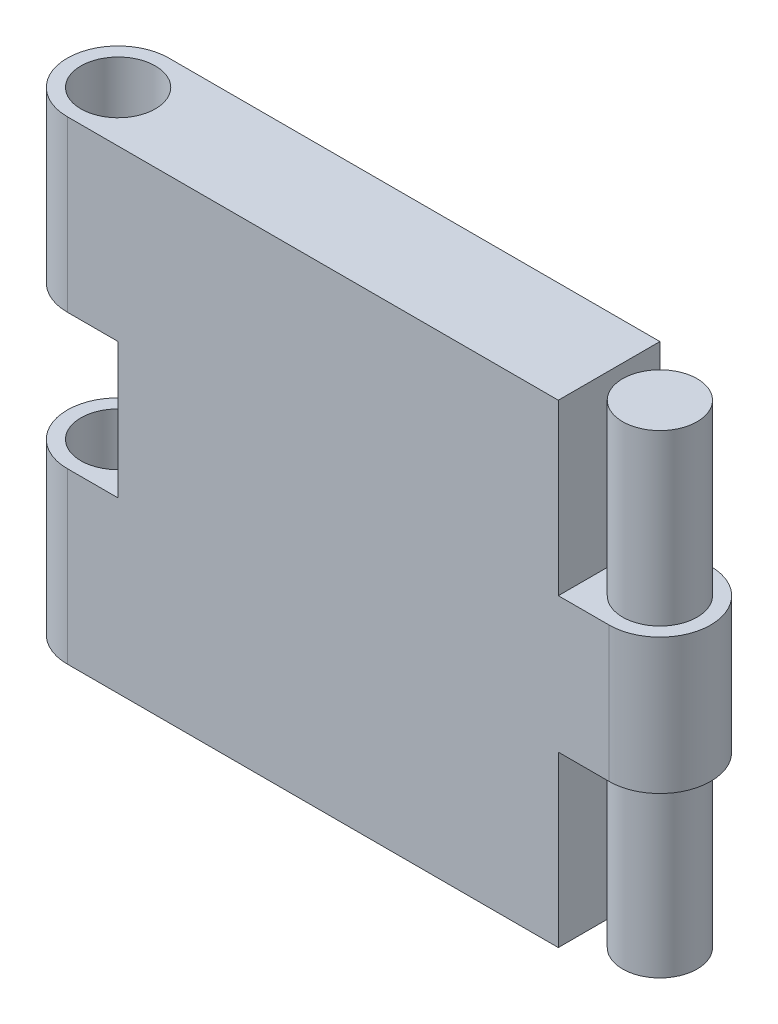
ISO-10303-21;
HEADER;
FILE_DESCRIPTION(('STEP AP214'),'2;1');
FILE_NAME('part.step','',(''),(''),'','','');
FILE_SCHEMA(('AUTOMOTIVE_DESIGN { 1 0 10303 214 1 1 1 1 }'));
ENDSEC;
DATA;
#1=APPLICATION_CONTEXT('core data for automotive mechanical design processes');
#2=APPLICATION_PROTOCOL_DEFINITION('international standard','automotive_design',2000,#1);
#3=PRODUCT_CONTEXT('',#1,'mechanical');
#4=PRODUCT('Part','Part','',(#3));
#5=PRODUCT_RELATED_PRODUCT_CATEGORY('part','',(#4));
#6=PRODUCT_DEFINITION_FORMATION('','',#4);
#7=PRODUCT_DEFINITION_CONTEXT('part definition',#1,'design');
#8=PRODUCT_DEFINITION('design','',#6,#7);
#9=PRODUCT_DEFINITION_SHAPE('','',#8);
#10=(LENGTH_UNIT() NAMED_UNIT(*) SI_UNIT(.MILLI.,.METRE.));
#11=(NAMED_UNIT(*) PLANE_ANGLE_UNIT() SI_UNIT($,.RADIAN.));
#12=(NAMED_UNIT(*) SI_UNIT($,.STERADIAN.) SOLID_ANGLE_UNIT());
#13=UNCERTAINTY_MEASURE_WITH_UNIT(LENGTH_MEASURE(1.E-05),#10,'distance_accuracy_value','');
#14=(GEOMETRIC_REPRESENTATION_CONTEXT(3) GLOBAL_UNCERTAINTY_ASSIGNED_CONTEXT((#13)) GLOBAL_UNIT_ASSIGNED_CONTEXT((#10,
#11,#12)) REPRESENTATION_CONTEXT('',''));
#15=CARTESIAN_POINT('',(0.,0.,0.));
#16=DIRECTION('',(0.,0.,1.));
#17=DIRECTION('',(1.,0.,0.));
#18=AXIS2_PLACEMENT_3D('',#15,#16,#17);
#19=CARTESIAN_POINT('',(47.5,10.,-7.5));
#20=DIRECTION('',(0.,1.,0.));
#21=DIRECTION('',(0.,0.,1.));
#22=AXIS2_PLACEMENT_3D('',#19,#20,#21);
#23=CYLINDRICAL_SURFACE('',#22,7.5);
#24=DIRECTION('',(0.,-1.,0.));
#25=VECTOR('',#24,1.);
#26=CARTESIAN_POINT('',(47.5,10.,-15.));
#27=LINE('',#26,#25);
#28=CARTESIAN_POINT('',(47.5,10.,-15.));
#29=VERTEX_POINT('',#28);
#30=CARTESIAN_POINT('',(47.5,-10.,-15.));
#31=VERTEX_POINT('',#30);
#32=EDGE_CURVE('E193',#29,#31,#27,.T.);
#33=ORIENTED_EDGE('',*,*,#32,.F.);
#34=CARTESIAN_POINT('',(47.5,10.,-7.5));
#35=DIRECTION('',(0.,1.,0.));
#36=DIRECTION('',(0.,0.,1.));
#37=AXIS2_PLACEMENT_3D('',#34,#35,#36);
#38=CIRCLE('',#37,7.5);
#39=CARTESIAN_POINT('',(47.5,10.,0.));
#40=VERTEX_POINT('',#39);
#41=EDGE_CURVE('E44',#40,#29,#38,.T.);
#42=ORIENTED_EDGE('',*,*,#41,.F.);
#43=DIRECTION('',(0.,1.,0.));
#44=VECTOR('',#43,1.);
#45=CARTESIAN_POINT('',(47.5,0.,0.));
#46=LINE('',#45,#44);
#47=CARTESIAN_POINT('',(47.5,-10.,0.));
#48=VERTEX_POINT('',#47);
#49=EDGE_CURVE('E195',#48,#40,#46,.T.);
#50=ORIENTED_EDGE('',*,*,#49,.F.);
#51=CARTESIAN_POINT('',(47.5,-10.,-7.5));
#52=DIRECTION('',(0.,1.,0.));
#53=DIRECTION('',(0.,0.,1.));
#54=AXIS2_PLACEMENT_3D('',#51,#52,#53);
#55=CIRCLE('',#54,7.5);
#56=EDGE_CURVE('E11',#31,#48,#55,.F.);
#57=ORIENTED_EDGE('',*,*,#56,.F.);
#58=EDGE_LOOP('',(#33,#42,#50,#57));
#59=FACE_BOUND('',#58,.T.);
#60=ADVANCED_FACE('F36',(#59),#23,.T.);
#61=CARTESIAN_POINT('',(40.,35.,-15.));
#62=DIRECTION('',(1.,0.,0.));
#63=DIRECTION('',(0.,0.,-1.));
#64=AXIS2_PLACEMENT_3D('',#61,#62,#63);
#65=PLANE('',#64);
#66=DIRECTION('',(0.,1.,0.));
#67=VECTOR('',#66,1.);
#68=CARTESIAN_POINT('',(40.,35.,-15.));
#69=LINE('',#68,#67);
#70=CARTESIAN_POINT('',(40.,-35.,-15.));
#71=VERTEX_POINT('',#70);
#72=CARTESIAN_POINT('',(40.,-10.,-15.));
#73=VERTEX_POINT('',#72);
#74=EDGE_CURVE('E145',#71,#73,#69,.T.);
#75=ORIENTED_EDGE('',*,*,#74,.T.);
#76=DIRECTION('',(0.,0.,1.));
#77=VECTOR('',#76,1.);
#78=CARTESIAN_POINT('',(40.,-10.,-15.));
#79=LINE('',#78,#77);
#80=CARTESIAN_POINT('',(40.,-10.,0.));
#81=VERTEX_POINT('',#80);
#82=EDGE_CURVE('E202',#73,#81,#79,.T.);
#83=ORIENTED_EDGE('',*,*,#82,.T.);
#84=DIRECTION('',(0.,1.,0.));
#85=VECTOR('',#84,1.);
#86=CARTESIAN_POINT('',(40.,35.,0.));
#87=LINE('',#86,#85);
#88=CARTESIAN_POINT('',(40.,-35.,0.));
#89=VERTEX_POINT('',#88);
#90=EDGE_CURVE('E159',#89,#81,#87,.T.);
#91=ORIENTED_EDGE('',*,*,#90,.F.);
#92=DIRECTION('',(0.,0.,1.));
#93=VECTOR('',#92,1.);
#94=CARTESIAN_POINT('',(40.,-35.,-15.));
#95=LINE('',#94,#93);
#96=EDGE_CURVE('E164',#71,#89,#95,.T.);
#97=ORIENTED_EDGE('',*,*,#96,.F.);
#98=EDGE_LOOP('',(#75,#83,#91,#97));
#99=FACE_BOUND('',#98,.T.);
#100=ADVANCED_FACE('F270',(#99),#65,.T.);
#101=CARTESIAN_POINT('',(-32.5,35.,-7.5));
#102=DIRECTION('',(0.,-1.,0.));
#103=DIRECTION('',(1.,0.,0.));
#104=AXIS2_PLACEMENT_3D('',#101,#102,#103);
#105=CYLINDRICAL_SURFACE('',#104,7.5);
#106=DIRECTION('',(0.,-1.,0.));
#107=VECTOR('',#106,1.);
#108=CARTESIAN_POINT('',(-32.5,0.,0.));
#109=LINE('',#108,#107);
#110=CARTESIAN_POINT('',(-32.5,-10.,0.));
#111=VERTEX_POINT('',#110);
#112=CARTESIAN_POINT('',(-32.5,-35.,0.));
#113=VERTEX_POINT('',#112);
#114=EDGE_CURVE('E167',#111,#113,#109,.T.);
#115=ORIENTED_EDGE('',*,*,#114,.F.);
#116=CARTESIAN_POINT('',(-32.5,-10.,-7.5));
#117=DIRECTION('',(0.,1.,0.));
#118=DIRECTION('',(0.,0.,1.));
#119=AXIS2_PLACEMENT_3D('',#116,#117,#118);
#120=CIRCLE('',#119,7.5);
#121=CARTESIAN_POINT('',(-32.5,-10.,-15.));
#122=VERTEX_POINT('',#121);
#123=EDGE_CURVE('E184',#111,#122,#120,.F.);
#124=ORIENTED_EDGE('',*,*,#123,.T.);
#125=DIRECTION('',(0.,1.,0.));
#126=VECTOR('',#125,1.);
#127=CARTESIAN_POINT('',(-32.5,35.,-15.));
#128=LINE('',#127,#126);
#129=CARTESIAN_POINT('',(-32.5,-35.,-15.));
#130=VERTEX_POINT('',#129);
#131=EDGE_CURVE('E173',#130,#122,#128,.T.);
#132=ORIENTED_EDGE('',*,*,#131,.F.);
#133=CARTESIAN_POINT('',(-32.5,-35.,-7.5));
#134=DIRECTION('',(0.,-1.,0.));
#135=DIRECTION('',(0.,0.,-1.));
#136=AXIS2_PLACEMENT_3D('',#133,#134,#135);
#137=CIRCLE('',#136,7.5);
#138=EDGE_CURVE('E178',#113,#130,#137,.T.);
#139=ORIENTED_EDGE('',*,*,#138,.F.);
#140=EDGE_LOOP('',(#115,#124,#132,#139));
#141=FACE_BOUND('',#140,.T.);
#142=ADVANCED_FACE('F263',(#141),#105,.T.);
#143=CARTESIAN_POINT('',(-32.5,50.556349186104,-7.5));
#144=DIRECTION('',(0.,-1.,0.));
#145=DIRECTION('',(0.,0.,-1.));
#146=AXIS2_PLACEMENT_3D('',#143,#144,#145);
#147=CYLINDRICAL_SURFACE('',#146,5.5);
#148=CARTESIAN_POINT('',(-32.5,-35.,-7.5));
#149=DIRECTION('',(0.,-1.,0.));
#150=DIRECTION('',(0.,0.,-1.));
#151=AXIS2_PLACEMENT_3D('',#148,#149,#150);
#152=CIRCLE('',#151,5.5);
#153=CARTESIAN_POINT('',(-32.5,-35.,-13.));
#154=VERTEX_POINT('',#153);
#155=EDGE_CURVE('E230',#154,#154,#152,.F.);
#156=ORIENTED_EDGE('',*,*,#155,.F.);
#157=EDGE_LOOP('',(#156));
#158=FACE_BOUND('',#157,.T.);
#159=CARTESIAN_POINT('',(-32.5,-10.,-7.5));
#160=DIRECTION('',(0.,1.,0.));
#161=DIRECTION('',(0.,0.,1.));
#162=AXIS2_PLACEMENT_3D('',#159,#160,#161);
#163=CIRCLE('',#162,5.5);
#164=CARTESIAN_POINT('',(-32.5,-10.,-2.));
#165=VERTEX_POINT('',#164);
#166=EDGE_CURVE('E181',#165,#165,#163,.T.);
#167=ORIENTED_EDGE('',*,*,#166,.T.);
#168=EDGE_LOOP('',(#167));
#169=FACE_BOUND('',#168,.T.);
#170=ADVANCED_FACE('F282',(#158,#169),#147,.F.);
#171=CARTESIAN_POINT('',(-32.5,10.,-7.5));
#172=DIRECTION('',(0.,1.,0.));
#173=DIRECTION('',(0.,0.,1.));
#174=AXIS2_PLACEMENT_3D('',#171,#172,#173);
#175=CIRCLE('',#174,7.5);
#176=CARTESIAN_POINT('',(-32.5,10.,0.));
#177=VERTEX_POINT('',#176);
#178=CARTESIAN_POINT('',(-32.5,10.,-15.));
#179=VERTEX_POINT('',#178);
#180=EDGE_CURVE('E189',#177,#179,#175,.F.);
#181=ORIENTED_EDGE('',*,*,#180,.F.);
#182=CARTESIAN_POINT('',(-32.5,35.,0.));
#183=VERTEX_POINT('',#182);
#184=EDGE_CURVE('E169',#183,#177,#109,.T.);
#185=ORIENTED_EDGE('',*,*,#184,.F.);
#186=CARTESIAN_POINT('',(-32.5,35.,-7.5));
#187=DIRECTION('',(0.,1.,0.));
#188=DIRECTION('',(0.,0.,1.));
#189=AXIS2_PLACEMENT_3D('',#186,#187,#188);
#190=CIRCLE('',#189,7.5);
#191=CARTESIAN_POINT('',(-32.5,35.,-15.));
#192=VERTEX_POINT('',#191);
#193=EDGE_CURVE('E176',#192,#183,#190,.T.);
#194=ORIENTED_EDGE('',*,*,#193,.F.);
#195=EDGE_CURVE('E172',#179,#192,#128,.T.);
#196=ORIENTED_EDGE('',*,*,#195,.F.);
#197=EDGE_LOOP('',(#181,#185,#194,#196));
#198=FACE_BOUND('',#197,.T.);
#199=ADVANCED_FACE('F245',(#198),#105,.T.);
#200=DIRECTION('',(0.,0.,1.));
#201=VECTOR('',#200,1.);
#202=CARTESIAN_POINT('',(40.,10.,-15.));
#203=LINE('',#202,#201);
#204=CARTESIAN_POINT('',(40.,10.,-15.));
#205=VERTEX_POINT('',#204);
#206=CARTESIAN_POINT('',(40.,10.,0.));
#207=VERTEX_POINT('',#206);
#208=EDGE_CURVE('E125',#205,#207,#203,.T.);
#209=ORIENTED_EDGE('',*,*,#208,.F.);
#210=CARTESIAN_POINT('',(40.,35.,-15.));
#211=VERTEX_POINT('',#210);
#212=EDGE_CURVE('E136',#205,#211,#69,.T.);
#213=ORIENTED_EDGE('',*,*,#212,.T.);
#214=DIRECTION('',(0.,0.,1.));
#215=VECTOR('',#214,1.);
#216=CARTESIAN_POINT('',(40.,35.,-15.));
#217=LINE('',#216,#215);
#218=CARTESIAN_POINT('',(40.,35.,0.));
#219=VERTEX_POINT('',#218);
#220=EDGE_CURVE('E158',#211,#219,#217,.T.);
#221=ORIENTED_EDGE('',*,*,#220,.T.);
#222=EDGE_CURVE('E138',#207,#219,#87,.T.);
#223=ORIENTED_EDGE('',*,*,#222,.F.);
#224=EDGE_LOOP('',(#209,#213,#221,#223));
#225=FACE_BOUND('',#224,.T.);
#226=ADVANCED_FACE('F134',(#225),#65,.T.);
#227=CARTESIAN_POINT('',(-40.,-35.,-15.));
#228=DIRECTION('',(0.,-1.,0.));
#229=DIRECTION('',(0.,0.,-1.));
#230=AXIS2_PLACEMENT_3D('',#227,#228,#229);
#231=PLANE('',#230);
#232=ORIENTED_EDGE('',*,*,#155,.T.);
#233=EDGE_LOOP('',(#232));
#234=FACE_BOUND('',#233,.T.);
#235=DIRECTION('',(1.,0.,0.));
#236=VECTOR('',#235,1.);
#237=CARTESIAN_POINT('',(-40.,-35.,0.));
#238=LINE('',#237,#236);
#239=EDGE_CURVE('E146',#113,#89,#238,.T.);
#240=ORIENTED_EDGE('',*,*,#239,.F.);
#241=ORIENTED_EDGE('',*,*,#138,.T.);
#242=DIRECTION('',(1.,0.,0.));
#243=VECTOR('',#242,1.);
#244=CARTESIAN_POINT('',(-40.,-35.,-15.));
#245=LINE('',#244,#243);
#246=EDGE_CURVE('E156',#130,#71,#245,.T.);
#247=ORIENTED_EDGE('',*,*,#246,.T.);
#248=ORIENTED_EDGE('',*,*,#96,.T.);
#249=EDGE_LOOP('',(#240,#241,#247,#248));
#250=FACE_BOUND('',#249,.T.);
#251=ADVANCED_FACE('F266',(#234,#250),#231,.T.);
#252=CARTESIAN_POINT('',(-40.,35.,-15.));
#253=DIRECTION('',(0.,1.,0.));
#254=DIRECTION('',(0.,0.,1.));
#255=AXIS2_PLACEMENT_3D('',#252,#253,#254);
#256=PLANE('',#255);
#257=CARTESIAN_POINT('',(-32.5,35.,-7.5));
#258=DIRECTION('',(0.,1.,0.));
#259=DIRECTION('',(0.,0.,1.));
#260=AXIS2_PLACEMENT_3D('',#257,#258,#259);
#261=CIRCLE('',#260,5.5);
#262=CARTESIAN_POINT('',(-32.5,35.,-2.));
#263=VERTEX_POINT('',#262);
#264=EDGE_CURVE('E153',#263,#263,#261,.T.);
#265=ORIENTED_EDGE('',*,*,#264,.F.);
#266=EDGE_LOOP('',(#265));
#267=FACE_BOUND('',#266,.T.);
#268=DIRECTION('',(-1.,0.,0.));
#269=VECTOR('',#268,1.);
#270=CARTESIAN_POINT('',(-40.,35.,-15.));
#271=LINE('',#270,#269);
#272=EDGE_CURVE('E144',#211,#192,#271,.T.);
#273=ORIENTED_EDGE('',*,*,#272,.T.);
#274=ORIENTED_EDGE('',*,*,#193,.T.);
#275=DIRECTION('',(-1.,0.,0.));
#276=VECTOR('',#275,1.);
#277=CARTESIAN_POINT('',(-40.,35.,0.));
#278=LINE('',#277,#276);
#279=EDGE_CURVE('E149',#219,#183,#278,.T.);
#280=ORIENTED_EDGE('',*,*,#279,.F.);
#281=ORIENTED_EDGE('',*,*,#220,.F.);
#282=EDGE_LOOP('',(#273,#274,#280,#281));
#283=FACE_BOUND('',#282,.T.);
#284=ADVANCED_FACE('F239',(#267,#283),#256,.T.);
#285=CARTESIAN_POINT('',(0.,0.,-15.));
#286=DIRECTION('',(0.,0.,1.));
#287=DIRECTION('',(1.,0.,0.));
#288=AXIS2_PLACEMENT_3D('',#285,#286,#287);
#289=PLANE('',#288);
#290=DIRECTION('',(-1.,0.,0.));
#291=VECTOR('',#290,1.);
#292=CARTESIAN_POINT('',(40.,10.,-15.));
#293=LINE('',#292,#291);
#294=EDGE_CURVE('E121',#29,#205,#293,.T.);
#295=ORIENTED_EDGE('',*,*,#294,.F.);
#296=ORIENTED_EDGE('',*,*,#32,.T.);
#297=DIRECTION('',(-1.,0.,0.));
#298=VECTOR('',#297,1.);
#299=CARTESIAN_POINT('',(40.,-10.,-15.));
#300=LINE('',#299,#298);
#301=EDGE_CURVE('E200',#31,#73,#300,.T.);
#302=ORIENTED_EDGE('',*,*,#301,.T.);
#303=ORIENTED_EDGE('',*,*,#74,.F.);
#304=ORIENTED_EDGE('',*,*,#246,.F.);
#305=ORIENTED_EDGE('',*,*,#131,.T.);
#306=DIRECTION('',(-1.,0.,0.));
#307=VECTOR('',#306,1.);
#308=CARTESIAN_POINT('',(-40.,-10.,-15.));
#309=LINE('',#308,#307);
#310=CARTESIAN_POINT('',(-25.,-10.,-15.));
#311=VERTEX_POINT('',#310);
#312=EDGE_CURVE('E211',#311,#122,#309,.T.);
#313=ORIENTED_EDGE('',*,*,#312,.F.);
#314=DIRECTION('',(0.,-1.,0.));
#315=VECTOR('',#314,1.);
#316=CARTESIAN_POINT('',(-25.,10.,-15.));
#317=LINE('',#316,#315);
#318=CARTESIAN_POINT('',(-25.,10.,-15.));
#319=VERTEX_POINT('',#318);
#320=EDGE_CURVE('E185',#319,#311,#317,.T.);
#321=ORIENTED_EDGE('',*,*,#320,.F.);
#322=DIRECTION('',(-1.,0.,0.));
#323=VECTOR('',#322,1.);
#324=CARTESIAN_POINT('',(-40.,10.,-15.));
#325=LINE('',#324,#323);
#326=EDGE_CURVE('E219',#319,#179,#325,.T.);
#327=ORIENTED_EDGE('',*,*,#326,.T.);
#328=ORIENTED_EDGE('',*,*,#195,.T.);
#329=ORIENTED_EDGE('',*,*,#272,.F.);
#330=ORIENTED_EDGE('',*,*,#212,.F.);
#331=EDGE_LOOP('',(#295,#296,#302,#303,#304,#305,#313,#321,#327,#328,#329,#330));
#332=FACE_BOUND('',#331,.T.);
#333=ADVANCED_FACE('F142',(#332),#289,.F.);
#334=CARTESIAN_POINT('',(0.,0.,0.));
#335=DIRECTION('',(0.,0.,1.));
#336=DIRECTION('',(1.,0.,0.));
#337=AXIS2_PLACEMENT_3D('',#334,#335,#336);
#338=PLANE('',#337);
#339=DIRECTION('',(1.,0.,0.));
#340=VECTOR('',#339,1.);
#341=CARTESIAN_POINT('',(40.,-10.,0.));
#342=LINE('',#341,#340);
#343=EDGE_CURVE('E199',#81,#48,#342,.T.);
#344=ORIENTED_EDGE('',*,*,#343,.T.);
#345=ORIENTED_EDGE('',*,*,#49,.T.);
#346=DIRECTION('',(1.,0.,0.));
#347=VECTOR('',#346,1.);
#348=CARTESIAN_POINT('',(40.,10.,0.));
#349=LINE('',#348,#347);
#350=EDGE_CURVE('E139',#207,#40,#349,.T.);
#351=ORIENTED_EDGE('',*,*,#350,.F.);
#352=ORIENTED_EDGE('',*,*,#222,.T.);
#353=ORIENTED_EDGE('',*,*,#279,.T.);
#354=ORIENTED_EDGE('',*,*,#184,.T.);
#355=DIRECTION('',(1.,0.,0.));
#356=VECTOR('',#355,1.);
#357=CARTESIAN_POINT('',(-40.,10.,0.));
#358=LINE('',#357,#356);
#359=CARTESIAN_POINT('',(-25.,10.,0.));
#360=VERTEX_POINT('',#359);
#361=EDGE_CURVE('E222',#177,#360,#358,.T.);
#362=ORIENTED_EDGE('',*,*,#361,.T.);
#363=DIRECTION('',(0.,-1.,0.));
#364=VECTOR('',#363,1.);
#365=CARTESIAN_POINT('',(-25.,10.,0.));
#366=LINE('',#365,#364);
#367=CARTESIAN_POINT('',(-25.,-10.,0.));
#368=VERTEX_POINT('',#367);
#369=EDGE_CURVE('E225',#360,#368,#366,.T.);
#370=ORIENTED_EDGE('',*,*,#369,.T.);
#371=DIRECTION('',(1.,0.,0.));
#372=VECTOR('',#371,1.);
#373=CARTESIAN_POINT('',(-40.,-10.,0.));
#374=LINE('',#373,#372);
#375=EDGE_CURVE('E214',#111,#368,#374,.T.);
#376=ORIENTED_EDGE('',*,*,#375,.F.);
#377=ORIENTED_EDGE('',*,*,#114,.T.);
#378=ORIENTED_EDGE('',*,*,#239,.T.);
#379=ORIENTED_EDGE('',*,*,#90,.T.);
#380=EDGE_LOOP('',(#344,#345,#351,#352,#353,#354,#362,#370,#376,#377,#378,#379));
#381=FACE_BOUND('',#380,.T.);
#382=ADVANCED_FACE('F198',(#381),#338,.T.);
#383=CARTESIAN_POINT('',(-32.5,10.,-7.5));
#384=DIRECTION('',(0.,1.,0.));
#385=DIRECTION('',(0.,0.,1.));
#386=AXIS2_PLACEMENT_3D('',#383,#384,#385);
#387=CIRCLE('',#386,5.5);
#388=CARTESIAN_POINT('',(-32.5,10.,-2.));
#389=VERTEX_POINT('',#388);
#390=EDGE_CURVE('E186',#389,#389,#387,.T.);
#391=ORIENTED_EDGE('',*,*,#390,.F.);
#392=EDGE_LOOP('',(#391));
#393=FACE_BOUND('',#392,.T.);
#394=ORIENTED_EDGE('',*,*,#264,.T.);
#395=EDGE_LOOP('',(#394));
#396=FACE_BOUND('',#395,.T.);
#397=ADVANCED_FACE('F295',(#393,#396),#147,.F.);
#398=CARTESIAN_POINT('',(-25.,10.,-15.));
#399=DIRECTION('',(-1.,0.,0.));
#400=DIRECTION('',(0.,0.,1.));
#401=AXIS2_PLACEMENT_3D('',#398,#399,#400);
#402=PLANE('',#401);
#403=ORIENTED_EDGE('',*,*,#369,.F.);
#404=DIRECTION('',(0.,0.,-1.));
#405=VECTOR('',#404,1.);
#406=CARTESIAN_POINT('',(-25.,10.,-15.));
#407=LINE('',#406,#405);
#408=EDGE_CURVE('E216',#360,#319,#407,.T.);
#409=ORIENTED_EDGE('',*,*,#408,.T.);
#410=ORIENTED_EDGE('',*,*,#320,.T.);
#411=DIRECTION('',(0.,0.,-1.));
#412=VECTOR('',#411,1.);
#413=CARTESIAN_POINT('',(-25.,-10.,-15.));
#414=LINE('',#413,#412);
#415=EDGE_CURVE('E208',#368,#311,#414,.T.);
#416=ORIENTED_EDGE('',*,*,#415,.F.);
#417=EDGE_LOOP('',(#403,#409,#410,#416));
#418=FACE_BOUND('',#417,.T.);
#419=ADVANCED_FACE('F253',(#418),#402,.T.);
#420=CARTESIAN_POINT('',(0.,10.,0.));
#421=DIRECTION('',(0.,1.,0.));
#422=DIRECTION('',(0.,0.,1.));
#423=AXIS2_PLACEMENT_3D('',#420,#421,#422);
#424=PLANE('',#423);
#425=ORIENTED_EDGE('',*,*,#180,.T.);
#426=ORIENTED_EDGE('',*,*,#326,.F.);
#427=ORIENTED_EDGE('',*,*,#408,.F.);
#428=ORIENTED_EDGE('',*,*,#361,.F.);
#429=EDGE_LOOP('',(#425,#426,#427,#428));
#430=FACE_BOUND('',#429,.T.);
#431=ORIENTED_EDGE('',*,*,#390,.T.);
#432=EDGE_LOOP('',(#431));
#433=FACE_BOUND('',#432,.T.);
#434=ADVANCED_FACE('F249',(#430,#433),#424,.F.);
#435=CARTESIAN_POINT('',(0.,-10.,0.));
#436=DIRECTION('',(0.,1.,0.));
#437=DIRECTION('',(0.,0.,1.));
#438=AXIS2_PLACEMENT_3D('',#435,#436,#437);
#439=PLANE('',#438);
#440=ORIENTED_EDGE('',*,*,#166,.F.);
#441=EDGE_LOOP('',(#440));
#442=FACE_BOUND('',#441,.T.);
#443=ORIENTED_EDGE('',*,*,#375,.T.);
#444=ORIENTED_EDGE('',*,*,#415,.T.);
#445=ORIENTED_EDGE('',*,*,#312,.T.);
#446=ORIENTED_EDGE('',*,*,#123,.F.);
#447=EDGE_LOOP('',(#443,#444,#445,#446));
#448=FACE_BOUND('',#447,.T.);
#449=ADVANCED_FACE('F259',(#442,#448),#439,.T.);
#450=CARTESIAN_POINT('',(0.,-10.,0.));
#451=DIRECTION('',(0.,1.,0.));
#452=DIRECTION('',(0.,0.,1.));
#453=AXIS2_PLACEMENT_3D('',#450,#451,#452);
#454=PLANE('',#453);
#455=CARTESIAN_POINT('',(47.5,-10.,-7.5));
#456=DIRECTION('',(0.,1.,0.));
#457=DIRECTION('',(0.,0.,1.));
#458=AXIS2_PLACEMENT_3D('',#455,#456,#457);
#459=CIRCLE('',#458,5.5);
#460=CARTESIAN_POINT('',(47.5,-10.,-13.));
#461=VERTEX_POINT('',#460);
#462=EDGE_CURVE('E180',#461,#461,#459,.F.);
#463=ORIENTED_EDGE('',*,*,#462,.F.);
#464=EDGE_LOOP('',(#463));
#465=FACE_BOUND('',#464,.T.);
#466=ORIENTED_EDGE('',*,*,#301,.F.);
#467=ORIENTED_EDGE('',*,*,#56,.T.);
#468=ORIENTED_EDGE('',*,*,#343,.F.);
#469=ORIENTED_EDGE('',*,*,#82,.F.);
#470=EDGE_LOOP('',(#466,#467,#468,#469));
#471=FACE_BOUND('',#470,.T.);
#472=ADVANCED_FACE('F273',(#465,#471),#454,.F.);
#473=CARTESIAN_POINT('',(0.,10.,0.));
#474=DIRECTION('',(0.,1.,0.));
#475=DIRECTION('',(0.,0.,1.));
#476=AXIS2_PLACEMENT_3D('',#473,#474,#475);
#477=PLANE('',#476);
#478=CARTESIAN_POINT('',(47.5,10.,-7.5));
#479=DIRECTION('',(0.,1.,0.));
#480=DIRECTION('',(0.,0.,1.));
#481=AXIS2_PLACEMENT_3D('',#478,#479,#480);
#482=CIRCLE('',#481,5.5);
#483=CARTESIAN_POINT('',(47.5,10.,-13.));
#484=VERTEX_POINT('',#483);
#485=EDGE_CURVE('E130',#484,#484,#482,.F.);
#486=ORIENTED_EDGE('',*,*,#485,.T.);
#487=EDGE_LOOP('',(#486));
#488=FACE_BOUND('',#487,.T.);
#489=ORIENTED_EDGE('',*,*,#350,.T.);
#490=ORIENTED_EDGE('',*,*,#41,.T.);
#491=ORIENTED_EDGE('',*,*,#294,.T.);
#492=ORIENTED_EDGE('',*,*,#208,.T.);
#493=EDGE_LOOP('',(#489,#490,#491,#492));
#494=FACE_BOUND('',#493,.T.);
#495=ADVANCED_FACE('F124',(#488,#494),#477,.T.);
#496=CARTESIAN_POINT('',(-40.,35.,-15.));
#497=DIRECTION('',(0.,1.,0.));
#498=DIRECTION('',(0.,0.,1.));
#499=AXIS2_PLACEMENT_3D('',#496,#497,#498);
#500=PLANE('',#499);
#501=CARTESIAN_POINT('',(47.5,35.,-7.5));
#502=DIRECTION('',(0.,1.,0.));
#503=DIRECTION('',(0.,0.,1.));
#504=AXIS2_PLACEMENT_3D('',#501,#502,#503);
#505=CIRCLE('',#504,5.5);
#506=CARTESIAN_POINT('',(47.5,35.,-13.));
#507=VERTEX_POINT('',#506);
#508=EDGE_CURVE('E192',#507,#507,#505,.T.);
#509=ORIENTED_EDGE('',*,*,#508,.T.);
#510=EDGE_LOOP('',(#509));
#511=FACE_BOUND('',#510,.T.);
#512=ADVANCED_FACE('F327',(#511),#500,.T.);
#513=CARTESIAN_POINT('',(47.5,50.556349186104,-7.5));
#514=DIRECTION('',(0.,-1.,0.));
#515=DIRECTION('',(0.,0.,-1.));
#516=AXIS2_PLACEMENT_3D('',#513,#514,#515);
#517=CYLINDRICAL_SURFACE('',#516,5.5);
#518=CARTESIAN_POINT('',(47.5,10.,-13.));
#519=CARTESIAN_POINT('',(47.5,10.2604166666667,-13.));
#520=CARTESIAN_POINT('',(47.5,10.5208333333333,-13.));
#521=CARTESIAN_POINT('',(47.5,11.0416666666667,-13.));
#522=CARTESIAN_POINT('',(47.5,11.3020833333333,-13.));
#523=CARTESIAN_POINT('',(47.5,11.8229166666667,-13.));
#524=CARTESIAN_POINT('',(47.5,12.0833333333333,-13.));
#525=CARTESIAN_POINT('',(47.5,12.6041666666667,-13.));
#526=CARTESIAN_POINT('',(47.5,12.8645833333333,-13.));
#527=CARTESIAN_POINT('',(47.5,13.3854166666667,-13.));
#528=CARTESIAN_POINT('',(47.5,13.6458333333333,-13.));
#529=CARTESIAN_POINT('',(47.5,14.1666666666667,-13.));
#530=CARTESIAN_POINT('',(47.5,14.4270833333333,-13.));
#531=CARTESIAN_POINT('',(47.5,14.9479166666667,-13.));
#532=CARTESIAN_POINT('',(47.5,15.2083333333333,-13.));
#533=CARTESIAN_POINT('',(47.5,15.7291666666667,-13.));
#534=CARTESIAN_POINT('',(47.5,15.9895833333333,-13.));
#535=CARTESIAN_POINT('',(47.5,16.5104166666667,-13.));
#536=CARTESIAN_POINT('',(47.5,16.7708333333333,-13.));
#537=CARTESIAN_POINT('',(47.5,17.2916666666667,-13.));
#538=CARTESIAN_POINT('',(47.5,17.5520833333333,-13.));
#539=CARTESIAN_POINT('',(47.5,18.0729166666667,-13.));
#540=CARTESIAN_POINT('',(47.5,18.3333333333333,-13.));
#541=CARTESIAN_POINT('',(47.5,18.8541666666667,-13.));
#542=CARTESIAN_POINT('',(47.5,19.1145833333333,-13.));
#543=CARTESIAN_POINT('',(47.5,19.6354166666667,-13.));
#544=CARTESIAN_POINT('',(47.5,19.8958333333333,-13.));
#545=CARTESIAN_POINT('',(47.5,20.4166666666667,-13.));
#546=CARTESIAN_POINT('',(47.5,20.6770833333333,-13.));
#547=CARTESIAN_POINT('',(47.5,21.1979166666667,-13.));
#548=CARTESIAN_POINT('',(47.5,21.4583333333333,-13.));
#549=CARTESIAN_POINT('',(47.5,21.9791666666667,-13.));
#550=CARTESIAN_POINT('',(47.5,22.2395833333333,-13.));
#551=CARTESIAN_POINT('',(47.5,22.7604166666667,-13.));
#552=CARTESIAN_POINT('',(47.5,23.0208333333333,-13.));
#553=CARTESIAN_POINT('',(47.5,23.5416666666667,-13.));
#554=CARTESIAN_POINT('',(47.5,23.8020833333333,-13.));
#555=CARTESIAN_POINT('',(47.5,24.3229166666667,-13.));
#556=CARTESIAN_POINT('',(47.5,24.5833333333333,-13.));
#557=CARTESIAN_POINT('',(47.5,25.1041666666667,-13.));
#558=CARTESIAN_POINT('',(47.5,25.3645833333333,-13.));
#559=CARTESIAN_POINT('',(47.5,25.8854166666667,-13.));
#560=CARTESIAN_POINT('',(47.5,26.1458333333333,-13.));
#561=CARTESIAN_POINT('',(47.5,26.6666666666667,-13.));
#562=CARTESIAN_POINT('',(47.5,26.9270833333333,-13.));
#563=CARTESIAN_POINT('',(47.5,27.4479166666667,-13.));
#564=CARTESIAN_POINT('',(47.5,27.7083333333333,-13.));
#565=CARTESIAN_POINT('',(47.5,28.2291666666667,-13.));
#566=CARTESIAN_POINT('',(47.5,28.4895833333333,-13.));
#567=CARTESIAN_POINT('',(47.5,29.0104166666667,-13.));
#568=CARTESIAN_POINT('',(47.5,29.2708333333333,-13.));
#569=CARTESIAN_POINT('',(47.5,29.7916666666667,-13.));
#570=CARTESIAN_POINT('',(47.5,30.0520833333333,-13.));
#571=CARTESIAN_POINT('',(47.5,30.5729166666667,-13.));
#572=CARTESIAN_POINT('',(47.5,30.8333333333333,-13.));
#573=CARTESIAN_POINT('',(47.5,31.3541666666667,-13.));
#574=CARTESIAN_POINT('',(47.5,31.6145833333333,-13.));
#575=CARTESIAN_POINT('',(47.5,32.1354166666667,-13.));
#576=CARTESIAN_POINT('',(47.5,32.3958333333333,-13.));
#577=CARTESIAN_POINT('',(47.5,32.9166666666667,-13.));
#578=CARTESIAN_POINT('',(47.5,33.1770833333333,-13.));
#579=CARTESIAN_POINT('',(47.5,33.6979166666667,-13.));
#580=CARTESIAN_POINT('',(47.5,33.9583333333333,-13.));
#581=CARTESIAN_POINT('',(47.5,34.4791666666667,-13.));
#582=CARTESIAN_POINT('',(47.5,34.7395833333333,-13.));
#583=CARTESIAN_POINT('',(47.5,35.,-13.));
#584=B_SPLINE_CURVE_WITH_KNOTS('',3,(#518,#519,#520,#521,#522,#523,#524,#525,#526,#527,#528,
#529,#530,#531,#532,#533,#534,#535,#536,#537,#538,#539,#540,#541,#542,#543,#544,#545,#546,#547,
#548,#549,#550,#551,#552,#553,#554,#555,#556,#557,#558,#559,#560,#561,#562,#563,#564,#565,#566,
#567,#568,#569,#570,#571,#572,#573,#574,#575,#576,#577,#578,#579,#580,#581,#582,#583),
.UNSPECIFIED.,.F.,.F.,(4,2,2,2,2,2,2,2,2,2,2,2,2,2,2,2,2,2,2,2,2,2,2,2,2,2,2,2,2,2,2,2,4),(0.,
0.781249999999997,1.5625,2.34375,3.125,3.90625,4.6875,5.46875,6.25,7.03125,7.8125,8.59375,9.375,
10.15625,10.9375,11.71875,12.5,13.28125,14.0625,14.84375,15.625,16.40625,17.1875,17.96875,18.75,
19.53125,20.3125,21.09375,21.875,22.65625,23.4375,24.21875,25.),.UNSPECIFIED.);
#585=EDGE_CURVE('BSEAM331',#484,#507,#584,.T.);
#586=ORIENTED_EDGE('',*,*,#485,.F.);
#587=ORIENTED_EDGE('',*,*,#508,.F.);
#588=ORIENTED_EDGE('',*,*,#585,.T.);
#589=ORIENTED_EDGE('',*,*,#585,.F.);
#590=EDGE_LOOP('',(#586,#588,#587,#589));
#591=FACE_BOUND('',#590,.T.);
#592=ADVANCED_FACE('F331',(#591),#517,.T.);
#593=CARTESIAN_POINT('',(47.5,-35.,-7.5));
#594=DIRECTION('',(0.,-1.,0.));
#595=DIRECTION('',(0.,0.,-1.));
#596=AXIS2_PLACEMENT_3D('',#593,#594,#595);
#597=CIRCLE('',#596,5.5);
#598=CARTESIAN_POINT('',(47.5,-35.,-13.));
#599=VERTEX_POINT('',#598);
#600=EDGE_CURVE('E346',#599,#599,#597,.F.);
#601=CARTESIAN_POINT('',(47.5,-35.,-13.));
#602=CARTESIAN_POINT('',(47.5,-34.7395833333333,-13.));
#603=CARTESIAN_POINT('',(47.5,-34.4791666666667,-13.));
#604=CARTESIAN_POINT('',(47.5,-33.9583333333333,-13.));
#605=CARTESIAN_POINT('',(47.5,-33.6979166666667,-13.));
#606=CARTESIAN_POINT('',(47.5,-33.1770833333333,-13.));
#607=CARTESIAN_POINT('',(47.5,-32.9166666666667,-13.));
#608=CARTESIAN_POINT('',(47.5,-32.3958333333333,-13.));
#609=CARTESIAN_POINT('',(47.5,-32.1354166666667,-13.));
#610=CARTESIAN_POINT('',(47.5,-31.6145833333333,-13.));
#611=CARTESIAN_POINT('',(47.5,-31.3541666666667,-13.));
#612=CARTESIAN_POINT('',(47.5,-30.8333333333333,-13.));
#613=CARTESIAN_POINT('',(47.5,-30.5729166666667,-13.));
#614=CARTESIAN_POINT('',(47.5,-30.0520833333333,-13.));
#615=CARTESIAN_POINT('',(47.5,-29.7916666666667,-13.));
#616=CARTESIAN_POINT('',(47.5,-29.2708333333333,-13.));
#617=CARTESIAN_POINT('',(47.5,-29.0104166666667,-13.));
#618=CARTESIAN_POINT('',(47.5,-28.4895833333333,-13.));
#619=CARTESIAN_POINT('',(47.5,-28.2291666666667,-13.));
#620=CARTESIAN_POINT('',(47.5,-27.7083333333333,-13.));
#621=CARTESIAN_POINT('',(47.5,-27.4479166666667,-13.));
#622=CARTESIAN_POINT('',(47.5,-26.9270833333333,-13.));
#623=CARTESIAN_POINT('',(47.5,-26.6666666666667,-13.));
#624=CARTESIAN_POINT('',(47.5,-26.1458333333333,-13.));
#625=CARTESIAN_POINT('',(47.5,-25.8854166666667,-13.));
#626=CARTESIAN_POINT('',(47.5,-25.3645833333333,-13.));
#627=CARTESIAN_POINT('',(47.5,-25.1041666666667,-13.));
#628=CARTESIAN_POINT('',(47.5,-24.5833333333333,-13.));
#629=CARTESIAN_POINT('',(47.5,-24.3229166666667,-13.));
#630=CARTESIAN_POINT('',(47.5,-23.8020833333333,-13.));
#631=CARTESIAN_POINT('',(47.5,-23.5416666666667,-13.));
#632=CARTESIAN_POINT('',(47.5,-23.0208333333333,-13.));
#633=CARTESIAN_POINT('',(47.5,-22.7604166666667,-13.));
#634=CARTESIAN_POINT('',(47.5,-22.2395833333333,-13.));
#635=CARTESIAN_POINT('',(47.5,-21.9791666666667,-13.));
#636=CARTESIAN_POINT('',(47.5,-21.4583333333333,-13.));
#637=CARTESIAN_POINT('',(47.5,-21.1979166666667,-13.));
#638=CARTESIAN_POINT('',(47.5,-20.6770833333333,-13.));
#639=CARTESIAN_POINT('',(47.5,-20.4166666666667,-13.));
#640=CARTESIAN_POINT('',(47.5,-19.8958333333333,-13.));
#641=CARTESIAN_POINT('',(47.5,-19.6354166666667,-13.));
#642=CARTESIAN_POINT('',(47.5,-19.1145833333333,-13.));
#643=CARTESIAN_POINT('',(47.5,-18.8541666666667,-13.));
#644=CARTESIAN_POINT('',(47.5,-18.3333333333333,-13.));
#645=CARTESIAN_POINT('',(47.5,-18.0729166666667,-13.));
#646=CARTESIAN_POINT('',(47.5,-17.5520833333333,-13.));
#647=CARTESIAN_POINT('',(47.5,-17.2916666666667,-13.));
#648=CARTESIAN_POINT('',(47.5,-16.7708333333333,-13.));
#649=CARTESIAN_POINT('',(47.5,-16.5104166666667,-13.));
#650=CARTESIAN_POINT('',(47.5,-15.9895833333333,-13.));
#651=CARTESIAN_POINT('',(47.5,-15.7291666666667,-13.));
#652=CARTESIAN_POINT('',(47.5,-15.2083333333333,-13.));
#653=CARTESIAN_POINT('',(47.5,-14.9479166666667,-13.));
#654=CARTESIAN_POINT('',(47.5,-14.4270833333333,-13.));
#655=CARTESIAN_POINT('',(47.5,-14.1666666666667,-13.));
#656=CARTESIAN_POINT('',(47.5,-13.6458333333333,-13.));
#657=CARTESIAN_POINT('',(47.5,-13.3854166666667,-13.));
#658=CARTESIAN_POINT('',(47.5,-12.8645833333333,-13.));
#659=CARTESIAN_POINT('',(47.5,-12.6041666666667,-13.));
#660=CARTESIAN_POINT('',(47.5,-12.0833333333333,-13.));
#661=CARTESIAN_POINT('',(47.5,-11.8229166666667,-13.));
#662=CARTESIAN_POINT('',(47.5,-11.3020833333333,-13.));
#663=CARTESIAN_POINT('',(47.5,-11.0416666666667,-13.));
#664=CARTESIAN_POINT('',(47.5,-10.5208333333333,-13.));
#665=CARTESIAN_POINT('',(47.5,-10.2604166666667,-13.));
#666=CARTESIAN_POINT('',(47.5,-10.,-13.));
#667=B_SPLINE_CURVE_WITH_KNOTS('',3,(#601,#602,#603,#604,#605,#606,#607,#608,#609,#610,#611,
#612,#613,#614,#615,#616,#617,#618,#619,#620,#621,#622,#623,#624,#625,#626,#627,#628,#629,#630,
#631,#632,#633,#634,#635,#636,#637,#638,#639,#640,#641,#642,#643,#644,#645,#646,#647,#648,#649,
#650,#651,#652,#653,#654,#655,#656,#657,#658,#659,#660,#661,#662,#663,#664,#665,#666),
.UNSPECIFIED.,.F.,.F.,(4,2,2,2,2,2,2,2,2,2,2,2,2,2,2,2,2,2,2,2,2,2,2,2,2,2,2,2,2,2,2,2,4),(0.,
0.781249999999997,1.56249999999999,2.34375000000001,3.125,3.90625,4.6875,5.46874999999999,
6.25000000000001,7.03125,7.8125,8.59375,9.37500000000001,10.15625,10.9375,11.71875,12.5,
13.28125,14.0625,14.84375,15.625,16.40625,17.1875,17.96875,18.75,19.53125,20.3125,21.09375,
21.875,22.65625,23.4375,24.21875,25.),.UNSPECIFIED.);
#668=EDGE_CURVE('BSEAM335',#599,#461,#667,.T.);
#669=ORIENTED_EDGE('',*,*,#600,.T.);
#670=ORIENTED_EDGE('',*,*,#462,.T.);
#671=ORIENTED_EDGE('',*,*,#668,.T.);
#672=ORIENTED_EDGE('',*,*,#668,.F.);
#673=EDGE_LOOP('',(#669,#671,#670,#672));
#674=FACE_BOUND('',#673,.T.);
#675=ADVANCED_FACE('F335',(#674),#517,.T.);
#676=CARTESIAN_POINT('',(-40.,-35.,-15.));
#677=DIRECTION('',(0.,-1.,0.));
#678=DIRECTION('',(0.,0.,-1.));
#679=AXIS2_PLACEMENT_3D('',#676,#677,#678);
#680=PLANE('',#679);
#681=ORIENTED_EDGE('',*,*,#600,.F.);
#682=EDGE_LOOP('',(#681));
#683=FACE_BOUND('',#682,.T.);
#684=ADVANCED_FACE('F337',(#683),#680,.T.);
#685=CLOSED_SHELL('',(#60,#100,#142,#170,#199,#226,#251,#284,#333,#382,#397,#419,#434,#449,#472,
#495,#512,#592,#675,#684));
#686=MANIFOLD_SOLID_BREP('B2',#685);
#687=ADVANCED_BREP_SHAPE_REPRESENTATION('',(#18,#686),#14);
#688=SHAPE_DEFINITION_REPRESENTATION(#9,#687);
ENDSEC;
END-ISO-10303-21;
